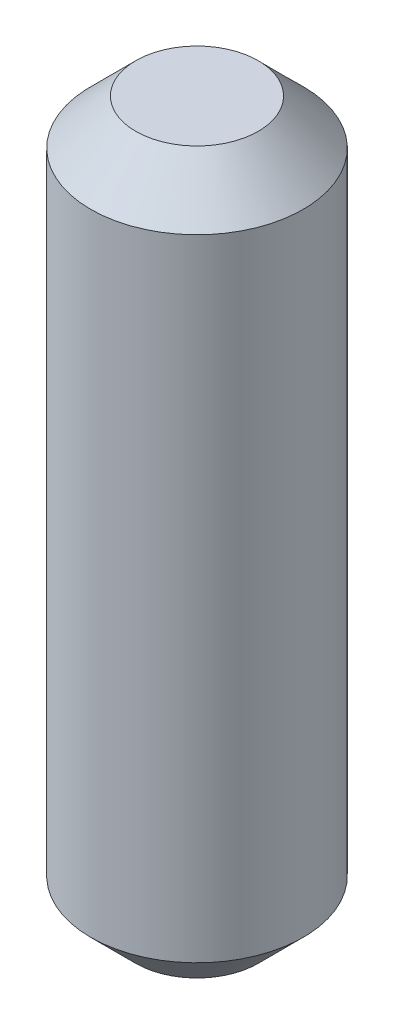
ISO-10303-21;
HEADER;
FILE_DESCRIPTION(('STEP AP214'),'2;1');
FILE_NAME('part.step','',(''),(''),'','','');
FILE_SCHEMA(('AUTOMOTIVE_DESIGN { 1 0 10303 214 1 1 1 1 }'));
ENDSEC;
DATA;
#1=APPLICATION_CONTEXT('core data for automotive mechanical design processes');
#2=APPLICATION_PROTOCOL_DEFINITION('international standard','automotive_design',2000,#1);
#3=PRODUCT_CONTEXT('',#1,'mechanical');
#4=PRODUCT('Part','Part','',(#3));
#5=PRODUCT_RELATED_PRODUCT_CATEGORY('part','',(#4));
#6=PRODUCT_DEFINITION_FORMATION('','',#4);
#7=PRODUCT_DEFINITION_CONTEXT('part definition',#1,'design');
#8=PRODUCT_DEFINITION('design','',#6,#7);
#9=PRODUCT_DEFINITION_SHAPE('','',#8);
#10=(LENGTH_UNIT() NAMED_UNIT(*) SI_UNIT(.MILLI.,.METRE.));
#11=(NAMED_UNIT(*) PLANE_ANGLE_UNIT() SI_UNIT($,.RADIAN.));
#12=(NAMED_UNIT(*) SI_UNIT($,.STERADIAN.) SOLID_ANGLE_UNIT());
#13=UNCERTAINTY_MEASURE_WITH_UNIT(LENGTH_MEASURE(1.E-05),#10,'distance_accuracy_value','');
#14=(GEOMETRIC_REPRESENTATION_CONTEXT(3) GLOBAL_UNCERTAINTY_ASSIGNED_CONTEXT((#13)) GLOBAL_UNIT_ASSIGNED_CONTEXT((#10,
#11,#12)) REPRESENTATION_CONTEXT('',''));
#15=CARTESIAN_POINT('',(0.,0.,0.));
#16=DIRECTION('',(0.,0.,1.));
#17=DIRECTION('',(1.,0.,0.));
#18=AXIS2_PLACEMENT_3D('',#15,#16,#17);
#19=CARTESIAN_POINT('',(0.,20.32,0.));
#20=DIRECTION('',(0.,-1.,0.));
#21=DIRECTION('',(0.,0.,-1.));
#22=AXIS2_PLACEMENT_3D('',#19,#20,#21);
#23=CYLINDRICAL_SURFACE('',#22,2.9972);
#24=CARTESIAN_POINT('',(0.,19.05,0.));
#25=DIRECTION('',(0.,1.,0.));
#26=DIRECTION('',(0.,0.,1.));
#27=AXIS2_PLACEMENT_3D('',#24,#25,#26);
#28=CIRCLE('',#27,2.9972);
#29=CARTESIAN_POINT('',(0.,19.05,2.9972));
#30=VERTEX_POINT('',#29);
#31=EDGE_CURVE('E53',#30,#30,#28,.F.);
#32=ORIENTED_EDGE('',*,*,#31,.T.);
#33=EDGE_LOOP('',(#32));
#34=FACE_BOUND('',#33,.T.);
#35=CARTESIAN_POINT('',(0.,1.27,0.));
#36=DIRECTION('',(0.,1.,0.));
#37=DIRECTION('',(0.,0.,1.));
#38=AXIS2_PLACEMENT_3D('',#35,#36,#37);
#39=CIRCLE('',#38,2.9972);
#40=CARTESIAN_POINT('',(0.,1.27,2.9972));
#41=VERTEX_POINT('',#40);
#42=EDGE_CURVE('E56',#41,#41,#39,.T.);
#43=ORIENTED_EDGE('',*,*,#42,.T.);
#44=EDGE_LOOP('',(#43));
#45=FACE_BOUND('',#44,.T.);
#46=ADVANCED_FACE('F44',(#34,#45),#23,.T.);
#47=CARTESIAN_POINT('',(0.,20.32,0.));
#48=DIRECTION('',(0.,1.,0.));
#49=DIRECTION('',(0.,0.,1.));
#50=AXIS2_PLACEMENT_3D('',#47,#48,#49);
#51=PLANE('',#50);
#52=CARTESIAN_POINT('',(0.,20.32,0.));
#53=DIRECTION('',(0.,1.,0.));
#54=DIRECTION('',(0.,0.,1.));
#55=AXIS2_PLACEMENT_3D('',#52,#53,#54);
#56=CIRCLE('',#55,1.7272);
#57=CARTESIAN_POINT('',(0.,20.32,1.7272));
#58=VERTEX_POINT('',#57);
#59=EDGE_CURVE('E63',#58,#58,#56,.T.);
#60=ORIENTED_EDGE('',*,*,#59,.T.);
#61=EDGE_LOOP('',(#60));
#62=FACE_BOUND('',#61,.T.);
#63=ADVANCED_FACE('F72',(#62),#51,.T.);
#64=CARTESIAN_POINT('',(0.,0.,0.));
#65=DIRECTION('',(0.,1.,0.));
#66=DIRECTION('',(0.,0.,1.));
#67=AXIS2_PLACEMENT_3D('',#64,#65,#66);
#68=PLANE('',#67);
#69=CARTESIAN_POINT('',(0.,0.,0.));
#70=DIRECTION('',(0.,1.,0.));
#71=DIRECTION('',(0.,0.,1.));
#72=AXIS2_PLACEMENT_3D('',#69,#70,#71);
#73=CIRCLE('',#72,1.72719999999999);
#74=CARTESIAN_POINT('',(0.,0.,1.72719999999999));
#75=VERTEX_POINT('',#74);
#76=EDGE_CURVE('E10',#75,#75,#73,.F.);
#77=ORIENTED_EDGE('',*,*,#76,.T.);
#78=EDGE_LOOP('',(#77));
#79=FACE_BOUND('',#78,.T.);
#80=ADVANCED_FACE('F73',(#79),#68,.F.);
#81=CARTESIAN_POINT('',(0.,20.32,0.));
#82=DIRECTION('',(0.,-1.,0.));
#83=DIRECTION('',(0.,0.,-1.));
#84=AXIS2_PLACEMENT_3D('',#81,#82,#83);
#85=CONICAL_SURFACE('',#84,1.7272,0.785398163397448);
#86=ORIENTED_EDGE('',*,*,#31,.F.);
#87=EDGE_LOOP('',(#86));
#88=FACE_BOUND('',#87,.T.);
#89=ORIENTED_EDGE('',*,*,#59,.F.);
#90=EDGE_LOOP('',(#89));
#91=FACE_BOUND('',#90,.T.);
#92=ADVANCED_FACE('F71',(#88,#91),#85,.T.);
#93=CARTESIAN_POINT('',(0.,1.27,0.));
#94=DIRECTION('',(0.,1.,0.));
#95=DIRECTION('',(0.,0.,1.));
#96=AXIS2_PLACEMENT_3D('',#93,#94,#95);
#97=CONICAL_SURFACE('',#96,2.9972,0.78539816339745);
#98=ORIENTED_EDGE('',*,*,#76,.F.);
#99=EDGE_LOOP('',(#98));
#100=FACE_BOUND('',#99,.T.);
#101=ORIENTED_EDGE('',*,*,#42,.F.);
#102=EDGE_LOOP('',(#101));
#103=FACE_BOUND('',#102,.T.);
#104=ADVANCED_FACE('F48',(#100,#103),#97,.T.);
#105=CLOSED_SHELL('',(#46,#63,#80,#92,#104));
#106=MANIFOLD_SOLID_BREP('B2',#105);
#107=ADVANCED_BREP_SHAPE_REPRESENTATION('',(#18,#106),#14);
#108=SHAPE_DEFINITION_REPRESENTATION(#9,#107);
ENDSEC;
END-ISO-10303-21;
